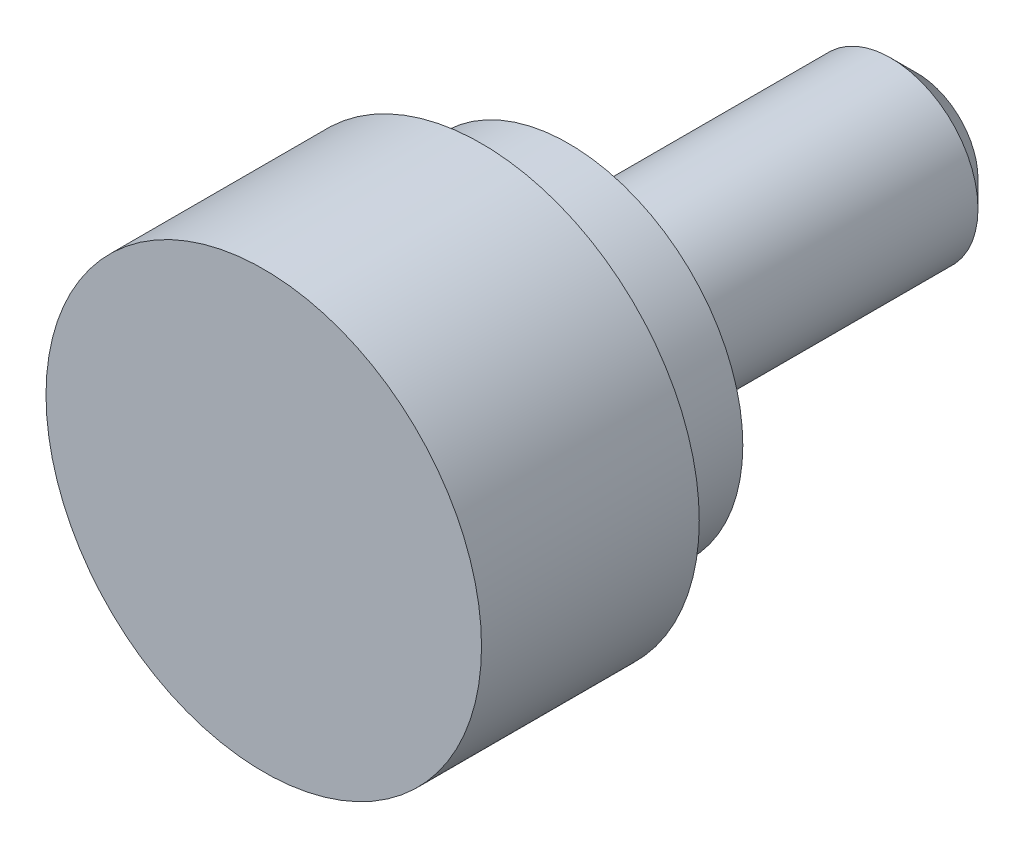
ISO-10303-21;
HEADER;
FILE_DESCRIPTION(('STEP AP214'),'2;1');
FILE_NAME('part.step','',(''),(''),'','','');
FILE_SCHEMA(('AUTOMOTIVE_DESIGN { 1 0 10303 214 1 1 1 1 }'));
ENDSEC;
DATA;
#1=APPLICATION_CONTEXT('core data for automotive mechanical design processes');
#2=APPLICATION_PROTOCOL_DEFINITION('international standard','automotive_design',2000,#1);
#3=PRODUCT_CONTEXT('',#1,'mechanical');
#4=PRODUCT('Part','Part','',(#3));
#5=PRODUCT_RELATED_PRODUCT_CATEGORY('part','',(#4));
#6=PRODUCT_DEFINITION_FORMATION('','',#4);
#7=PRODUCT_DEFINITION_CONTEXT('part definition',#1,'design');
#8=PRODUCT_DEFINITION('design','',#6,#7);
#9=PRODUCT_DEFINITION_SHAPE('','',#8);
#10=(LENGTH_UNIT() NAMED_UNIT(*) SI_UNIT(.MILLI.,.METRE.));
#11=(NAMED_UNIT(*) PLANE_ANGLE_UNIT() SI_UNIT($,.RADIAN.));
#12=(NAMED_UNIT(*) SI_UNIT($,.STERADIAN.) SOLID_ANGLE_UNIT());
#13=UNCERTAINTY_MEASURE_WITH_UNIT(LENGTH_MEASURE(1.E-05),#10,'distance_accuracy_value','');
#14=(GEOMETRIC_REPRESENTATION_CONTEXT(3) GLOBAL_UNCERTAINTY_ASSIGNED_CONTEXT((#13)) GLOBAL_UNIT_ASSIGNED_CONTEXT((#10,
#11,#12)) REPRESENTATION_CONTEXT('',''));
#15=CARTESIAN_POINT('',(0.,0.,0.));
#16=DIRECTION('',(0.,0.,1.));
#17=DIRECTION('',(1.,0.,0.));
#18=AXIS2_PLACEMENT_3D('',#15,#16,#17);
#19=CARTESIAN_POINT('',(0.,0.,-12.7));
#20=DIRECTION('',(0.,0.,1.));
#21=DIRECTION('',(1.,0.,0.));
#22=AXIS2_PLACEMENT_3D('',#19,#20,#21);
#23=CYLINDRICAL_SURFACE('',#22,3.175);
#24=CARTESIAN_POINT('',(0.,0.,-11.7475));
#25=DIRECTION('',(0.,0.,1.));
#26=DIRECTION('',(1.,0.,0.));
#27=AXIS2_PLACEMENT_3D('',#24,#25,#26);
#28=CIRCLE('',#27,3.175);
#29=CARTESIAN_POINT('',(3.175,0.,-11.7475));
#30=VERTEX_POINT('',#29);
#31=EDGE_CURVE('E42',#30,#30,#28,.T.);
#32=ORIENTED_EDGE('',*,*,#31,.T.);
#33=EDGE_LOOP('',(#32));
#34=FACE_BOUND('',#33,.T.);
#35=CARTESIAN_POINT('',(0.,0.,0.));
#36=DIRECTION('',(0.,0.,1.));
#37=DIRECTION('',(1.,0.,0.));
#38=AXIS2_PLACEMENT_3D('',#35,#36,#37);
#39=CIRCLE('',#38,3.175);
#40=CARTESIAN_POINT('',(3.175,0.,0.));
#41=VERTEX_POINT('',#40);
#42=EDGE_CURVE('E46',#41,#41,#39,.T.);
#43=ORIENTED_EDGE('',*,*,#42,.F.);
#44=EDGE_LOOP('',(#43));
#45=FACE_BOUND('',#44,.T.);
#46=ADVANCED_FACE('F35',(#34,#45),#23,.T.);
#47=CARTESIAN_POINT('',(0.,0.,-12.7));
#48=DIRECTION('',(0.,0.,1.));
#49=DIRECTION('',(1.,0.,0.));
#50=AXIS2_PLACEMENT_3D('',#47,#48,#49);
#51=PLANE('',#50);
#52=CARTESIAN_POINT('',(0.,0.,-12.7));
#53=DIRECTION('',(0.,0.,1.));
#54=DIRECTION('',(1.,0.,0.));
#55=AXIS2_PLACEMENT_3D('',#52,#53,#54);
#56=CIRCLE('',#55,2.2225);
#57=CARTESIAN_POINT('',(2.2225,0.,-12.7));
#58=VERTEX_POINT('',#57);
#59=EDGE_CURVE('E10',#58,#58,#56,.F.);
#60=ORIENTED_EDGE('',*,*,#59,.T.);
#61=EDGE_LOOP('',(#60));
#62=FACE_BOUND('',#61,.T.);
#63=ADVANCED_FACE('F92',(#62),#51,.F.);
#64=CARTESIAN_POINT('',(0.,0.,-11.7475));
#65=DIRECTION('',(0.,0.,1.));
#66=DIRECTION('',(1.,0.,0.));
#67=AXIS2_PLACEMENT_3D('',#64,#65,#66);
#68=CONICAL_SURFACE('',#67,3.175,0.78539816339745);
#69=ORIENTED_EDGE('',*,*,#59,.F.);
#70=EDGE_LOOP('',(#69));
#71=FACE_BOUND('',#70,.T.);
#72=ORIENTED_EDGE('',*,*,#31,.F.);
#73=EDGE_LOOP('',(#72));
#74=FACE_BOUND('',#73,.T.);
#75=ADVANCED_FACE('F37',(#71,#74),#68,.T.);
#76=CARTESIAN_POINT('',(0.,0.,3.175));
#77=DIRECTION('',(0.,0.,-1.));
#78=DIRECTION('',(-1.,0.,0.));
#79=AXIS2_PLACEMENT_3D('',#76,#77,#78);
#80=CYLINDRICAL_SURFACE('',#79,6.35);
#81=CARTESIAN_POINT('',(0.,0.,3.175));
#82=DIRECTION('',(0.,0.,1.));
#83=DIRECTION('',(1.,0.,0.));
#84=AXIS2_PLACEMENT_3D('',#81,#82,#83);
#85=CIRCLE('',#84,6.35);
#86=CARTESIAN_POINT('',(6.35,0.,3.175));
#87=VERTEX_POINT('',#86);
#88=EDGE_CURVE('E50',#87,#87,#85,.T.);
#89=ORIENTED_EDGE('',*,*,#88,.F.);
#90=EDGE_LOOP('',(#89));
#91=FACE_BOUND('',#90,.T.);
#92=CARTESIAN_POINT('',(0.,0.,0.));
#93=DIRECTION('',(0.,0.,1.));
#94=DIRECTION('',(1.,0.,0.));
#95=AXIS2_PLACEMENT_3D('',#92,#93,#94);
#96=CIRCLE('',#95,6.35);
#97=CARTESIAN_POINT('',(6.35,0.,0.));
#98=VERTEX_POINT('',#97);
#99=EDGE_CURVE('E53',#98,#98,#96,.T.);
#100=ORIENTED_EDGE('',*,*,#99,.T.);
#101=EDGE_LOOP('',(#100));
#102=FACE_BOUND('',#101,.T.);
#103=ADVANCED_FACE('F80',(#91,#102),#80,.T.);
#104=CARTESIAN_POINT('',(0.,0.,0.));
#105=DIRECTION('',(0.,0.,1.));
#106=DIRECTION('',(1.,0.,0.));
#107=AXIS2_PLACEMENT_3D('',#104,#105,#106);
#108=PLANE('',#107);
#109=ORIENTED_EDGE('',*,*,#42,.T.);
#110=EDGE_LOOP('',(#109));
#111=FACE_BOUND('',#110,.T.);
#112=ORIENTED_EDGE('',*,*,#99,.F.);
#113=EDGE_LOOP('',(#112));
#114=FACE_BOUND('',#113,.T.);
#115=ADVANCED_FACE('F76',(#111,#114),#108,.F.);
#116=CARTESIAN_POINT('',(0.,0.,3.175));
#117=DIRECTION('',(0.,0.,1.));
#118=DIRECTION('',(1.,0.,0.));
#119=AXIS2_PLACEMENT_3D('',#116,#117,#118);
#120=PLANE('',#119);
#121=CARTESIAN_POINT('',(0.,0.,3.175));
#122=DIRECTION('',(0.,0.,1.));
#123=DIRECTION('',(1.,0.,0.));
#124=AXIS2_PLACEMENT_3D('',#121,#122,#123);
#125=CIRCLE('',#124,7.9375);
#126=CARTESIAN_POINT('',(7.9375,0.,3.175));
#127=VERTEX_POINT('',#126);
#128=EDGE_CURVE('E59',#127,#127,#125,.T.);
#129=ORIENTED_EDGE('',*,*,#128,.F.);
#130=EDGE_LOOP('',(#129));
#131=FACE_BOUND('',#130,.T.);
#132=ORIENTED_EDGE('',*,*,#88,.T.);
#133=EDGE_LOOP('',(#132));
#134=FACE_BOUND('',#133,.T.);
#135=ADVANCED_FACE('F70',(#131,#134),#120,.F.);
#136=CARTESIAN_POINT('',(0.,0.,11.1125));
#137=DIRECTION('',(0.,0.,-1.));
#138=DIRECTION('',(-1.,0.,0.));
#139=AXIS2_PLACEMENT_3D('',#136,#137,#138);
#140=CYLINDRICAL_SURFACE('',#139,7.9375);
#141=CARTESIAN_POINT('',(0.,0.,11.1125));
#142=DIRECTION('',(0.,0.,1.));
#143=DIRECTION('',(1.,0.,0.));
#144=AXIS2_PLACEMENT_3D('',#141,#142,#143);
#145=CIRCLE('',#144,7.9375);
#146=CARTESIAN_POINT('',(7.9375,0.,11.1125));
#147=VERTEX_POINT('',#146);
#148=EDGE_CURVE('E56',#147,#147,#145,.T.);
#149=ORIENTED_EDGE('',*,*,#148,.F.);
#150=EDGE_LOOP('',(#149));
#151=FACE_BOUND('',#150,.T.);
#152=ORIENTED_EDGE('',*,*,#128,.T.);
#153=EDGE_LOOP('',(#152));
#154=FACE_BOUND('',#153,.T.);
#155=ADVANCED_FACE('F67',(#151,#154),#140,.T.);
#156=CARTESIAN_POINT('',(0.,0.,11.1125));
#157=DIRECTION('',(0.,0.,1.));
#158=DIRECTION('',(1.,0.,0.));
#159=AXIS2_PLACEMENT_3D('',#156,#157,#158);
#160=PLANE('',#159);
#161=ORIENTED_EDGE('',*,*,#148,.T.);
#162=EDGE_LOOP('',(#161));
#163=FACE_BOUND('',#162,.T.);
#164=ADVANCED_FACE('F65',(#163),#160,.T.);
#165=CLOSED_SHELL('',(#46,#63,#75,#103,#115,#135,#155,#164));
#166=MANIFOLD_SOLID_BREP('B2',#165);
#167=ADVANCED_BREP_SHAPE_REPRESENTATION('',(#18,#166),#14);
#168=SHAPE_DEFINITION_REPRESENTATION(#9,#167);
ENDSEC;
END-ISO-10303-21;
